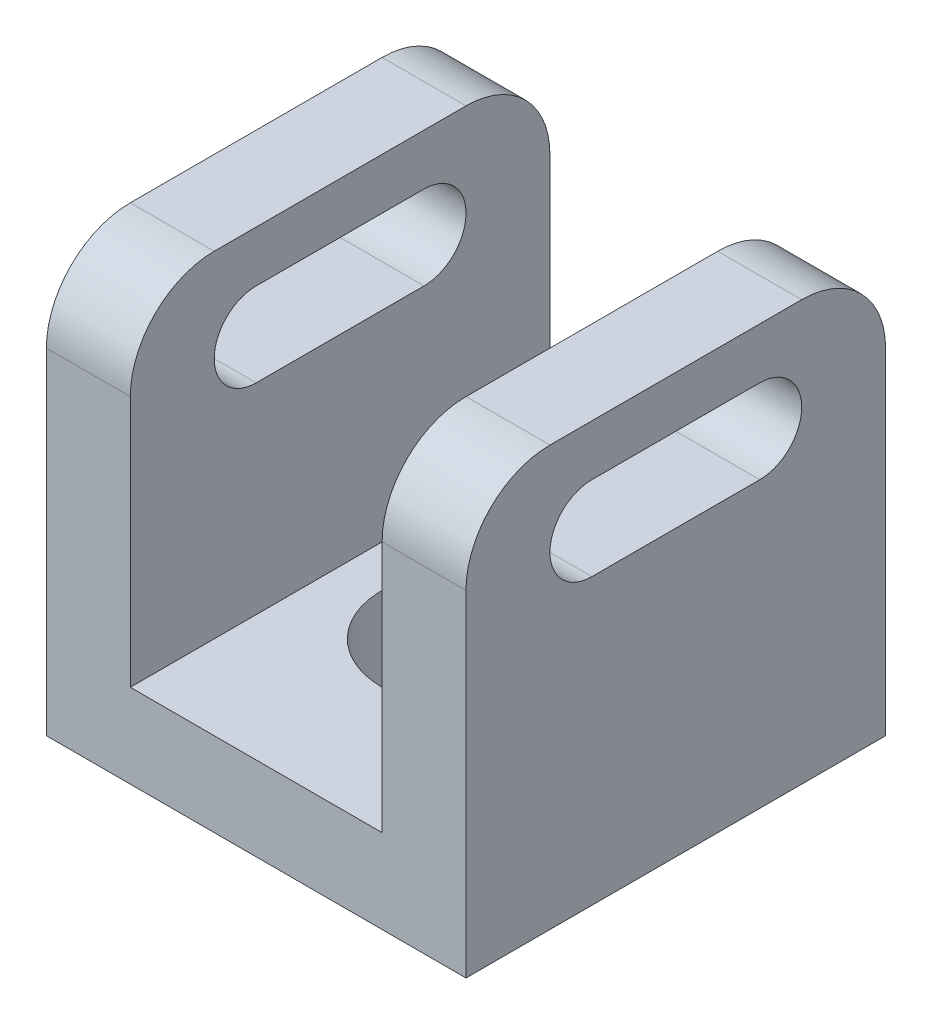
ISO-10303-21;
HEADER;
FILE_DESCRIPTION(('STEP AP214'),'2;1');
FILE_NAME('part.step','',(''),(''),'','','');
FILE_SCHEMA(('AUTOMOTIVE_DESIGN { 1 0 10303 214 1 1 1 1 }'));
ENDSEC;
DATA;
#1=APPLICATION_CONTEXT('core data for automotive mechanical design processes');
#2=APPLICATION_PROTOCOL_DEFINITION('international standard','automotive_design',2000,#1);
#3=PRODUCT_CONTEXT('',#1,'mechanical');
#4=PRODUCT('Part','Part','',(#3));
#5=PRODUCT_RELATED_PRODUCT_CATEGORY('part','',(#4));
#6=PRODUCT_DEFINITION_FORMATION('','',#4);
#7=PRODUCT_DEFINITION_CONTEXT('part definition',#1,'design');
#8=PRODUCT_DEFINITION('design','',#6,#7);
#9=PRODUCT_DEFINITION_SHAPE('','',#8);
#10=(LENGTH_UNIT() NAMED_UNIT(*) SI_UNIT(.MILLI.,.METRE.));
#11=(NAMED_UNIT(*) PLANE_ANGLE_UNIT() SI_UNIT($,.RADIAN.));
#12=(NAMED_UNIT(*) SI_UNIT($,.STERADIAN.) SOLID_ANGLE_UNIT());
#13=UNCERTAINTY_MEASURE_WITH_UNIT(LENGTH_MEASURE(1.E-05),#10,'distance_accuracy_value','');
#14=(GEOMETRIC_REPRESENTATION_CONTEXT(3) GLOBAL_UNCERTAINTY_ASSIGNED_CONTEXT((#13)) GLOBAL_UNIT_ASSIGNED_CONTEXT((#10,
#11,#12)) REPRESENTATION_CONTEXT('',''));
#15=CARTESIAN_POINT('',(0.,0.,0.));
#16=DIRECTION('',(0.,0.,1.));
#17=DIRECTION('',(1.,0.,0.));
#18=AXIS2_PLACEMENT_3D('',#15,#16,#17);
#19=CARTESIAN_POINT('',(-67.2311658603121,21.7065868263473,50.));
#20=DIRECTION('',(1.,0.,0.));
#21=DIRECTION('',(0.,0.,-1.));
#22=AXIS2_PLACEMENT_3D('',#19,#20,#21);
#23=PLANE('',#22);
#24=DIRECTION('',(0.,0.,1.));
#25=VECTOR('',#24,1.);
#26=CARTESIAN_POINT('',(-67.2311658603122,22.6625655060797,35.));
#27=LINE('',#26,#25);
#28=CARTESIAN_POINT('',(-67.2311658603122,22.6625655060797,15.));
#29=VERTEX_POINT('',#28);
#30=CARTESIAN_POINT('',(-67.2311658603122,22.6625655060797,35.));
#31=VERTEX_POINT('',#30);
#32=EDGE_CURVE('E216',#29,#31,#27,.T.);
#33=ORIENTED_EDGE('',*,*,#32,.T.);
#34=CARTESIAN_POINT('',(-67.2311658603121,17.6625655060797,35.));
#35=DIRECTION('',(1.,0.,0.));
#36=DIRECTION('',(0.,1.,0.));
#37=AXIS2_PLACEMENT_3D('',#34,#35,#36);
#38=CIRCLE('',#37,5.);
#39=CARTESIAN_POINT('',(-67.2311658603121,12.6625655060797,35.));
#40=VERTEX_POINT('',#39);
#41=EDGE_CURVE('E193',#31,#40,#38,.T.);
#42=ORIENTED_EDGE('',*,*,#41,.T.);
#43=DIRECTION('',(0.,0.,-1.));
#44=VECTOR('',#43,1.);
#45=CARTESIAN_POINT('',(-67.2311658603121,12.6625655060797,35.));
#46=LINE('',#45,#44);
#47=CARTESIAN_POINT('',(-67.2311658603121,12.6625655060797,15.));
#48=VERTEX_POINT('',#47);
#49=EDGE_CURVE('E205',#40,#48,#46,.T.);
#50=ORIENTED_EDGE('',*,*,#49,.T.);
#51=CARTESIAN_POINT('',(-67.2311658603121,17.6625655060797,15.));
#52=DIRECTION('',(1.,0.,0.));
#53=DIRECTION('',(0.,1.,0.));
#54=AXIS2_PLACEMENT_3D('',#51,#52,#53);
#55=CIRCLE('',#54,5.);
#56=EDGE_CURVE('E212',#48,#29,#55,.T.);
#57=ORIENTED_EDGE('',*,*,#56,.T.);
#58=EDGE_LOOP('',(#33,#42,#50,#57));
#59=FACE_BOUND('',#58,.T.);
#60=DIRECTION('',(0.,-1.,0.));
#61=VECTOR('',#60,1.);
#62=CARTESIAN_POINT('',(-67.2311658603121,21.7065868263473,50.));
#63=LINE('',#62,#61);
#64=CARTESIAN_POINT('',(-67.2311658603121,18.7425149700599,50.));
#65=VERTEX_POINT('',#64);
#66=CARTESIAN_POINT('',(-67.2311658603121,-21.2574850299401,50.));
#67=VERTEX_POINT('',#66);
#68=EDGE_CURVE('E266',#65,#67,#63,.T.);
#69=ORIENTED_EDGE('',*,*,#68,.F.);
#70=CARTESIAN_POINT('',(-67.2311658603121,18.7425149700599,40.));
#71=DIRECTION('',(1.,0.,0.));
#72=DIRECTION('',(0.,0.,-1.));
#73=AXIS2_PLACEMENT_3D('',#70,#71,#72);
#74=CIRCLE('',#73,10.);
#75=CARTESIAN_POINT('',(-67.2311658603121,28.7425149700599,40.));
#76=VERTEX_POINT('',#75);
#77=EDGE_CURVE('E365',#65,#76,#74,.F.);
#78=ORIENTED_EDGE('',*,*,#77,.T.);
#79=DIRECTION('',(0.,0.,-1.));
#80=VECTOR('',#79,1.);
#81=CARTESIAN_POINT('',(-67.2311658603121,28.7425149700599,50.));
#82=LINE('',#81,#80);
#83=CARTESIAN_POINT('',(-67.2311658603121,28.7425149700599,10.));
#84=VERTEX_POINT('',#83);
#85=EDGE_CURVE('E286',#76,#84,#82,.T.);
#86=ORIENTED_EDGE('',*,*,#85,.T.);
#87=CARTESIAN_POINT('',(-67.2311658603121,18.7425149700599,10.));
#88=DIRECTION('',(1.,0.,0.));
#89=DIRECTION('',(0.,0.,-1.));
#90=AXIS2_PLACEMENT_3D('',#87,#88,#89);
#91=CIRCLE('',#90,10.);
#92=CARTESIAN_POINT('',(-67.2311658603121,18.7425149700599,0.));
#93=VERTEX_POINT('',#92);
#94=EDGE_CURVE('E362',#84,#93,#91,.F.);
#95=ORIENTED_EDGE('',*,*,#94,.T.);
#96=DIRECTION('',(0.,-1.,0.));
#97=VECTOR('',#96,1.);
#98=CARTESIAN_POINT('',(-67.2311658603121,21.7065868263473,0.));
#99=LINE('',#98,#97);
#100=CARTESIAN_POINT('',(-67.2311658603121,-21.2574850299401,0.));
#101=VERTEX_POINT('',#100);
#102=EDGE_CURVE('E265',#93,#101,#99,.T.);
#103=ORIENTED_EDGE('',*,*,#102,.T.);
#104=DIRECTION('',(0.,0.,-1.));
#105=VECTOR('',#104,1.);
#106=CARTESIAN_POINT('',(-67.2311658603121,-21.2574850299401,50.));
#107=LINE('',#106,#105);
#108=EDGE_CURVE('E332',#67,#101,#107,.T.);
#109=ORIENTED_EDGE('',*,*,#108,.F.);
#110=EDGE_LOOP('',(#69,#78,#86,#95,#103,#109));
#111=FACE_BOUND('',#110,.T.);
#112=ADVANCED_FACE('F47',(#59,#111),#23,.F.);
#113=CARTESIAN_POINT('',(-67.2311658603121,-21.2574850299401,50.));
#114=DIRECTION('',(0.,1.,0.));
#115=DIRECTION('',(0.,0.,1.));
#116=AXIS2_PLACEMENT_3D('',#113,#114,#115);
#117=PLANE('',#116);
#118=CARTESIAN_POINT('',(-42.2311658603121,-21.2574850299401,25.));
#119=DIRECTION('',(0.,1.,0.));
#120=DIRECTION('',(0.,0.,1.));
#121=AXIS2_PLACEMENT_3D('',#118,#119,#120);
#122=CIRCLE('',#121,10.);
#123=CARTESIAN_POINT('',(-42.2311658603121,-21.2574850299401,35.));
#124=VERTEX_POINT('',#123);
#125=EDGE_CURVE('E261',#124,#124,#122,.F.);
#126=ORIENTED_EDGE('',*,*,#125,.F.);
#127=EDGE_LOOP('',(#126));
#128=FACE_BOUND('',#127,.T.);
#129=DIRECTION('',(1.,0.,0.));
#130=VECTOR('',#129,1.);
#131=CARTESIAN_POINT('',(-67.2311658603121,-21.2574850299401,0.));
#132=LINE('',#131,#130);
#133=CARTESIAN_POINT('',(-17.2311658603121,-21.2574850299401,0.));
#134=VERTEX_POINT('',#133);
#135=EDGE_CURVE('E289',#101,#134,#132,.T.);
#136=ORIENTED_EDGE('',*,*,#135,.T.);
#137=DIRECTION('',(0.,0.,-1.));
#138=VECTOR('',#137,1.);
#139=CARTESIAN_POINT('',(-17.2311658603121,-21.2574850299401,50.));
#140=LINE('',#139,#138);
#141=CARTESIAN_POINT('',(-17.2311658603121,-21.2574850299401,50.));
#142=VERTEX_POINT('',#141);
#143=EDGE_CURVE('E328',#142,#134,#140,.T.);
#144=ORIENTED_EDGE('',*,*,#143,.F.);
#145=DIRECTION('',(1.,0.,0.));
#146=VECTOR('',#145,1.);
#147=CARTESIAN_POINT('',(-67.2311658603121,-21.2574850299401,50.));
#148=LINE('',#147,#146);
#149=EDGE_CURVE('E269',#67,#142,#148,.T.);
#150=ORIENTED_EDGE('',*,*,#149,.F.);
#151=ORIENTED_EDGE('',*,*,#108,.T.);
#152=EDGE_LOOP('',(#136,#144,#150,#151));
#153=FACE_BOUND('',#152,.T.);
#154=ADVANCED_FACE('F447',(#128,#153),#117,.F.);
#155=CARTESIAN_POINT('',(-17.2311658603121,21.7065868263473,50.));
#156=DIRECTION('',(-1.,0.,0.));
#157=DIRECTION('',(0.,-1.,0.));
#158=AXIS2_PLACEMENT_3D('',#155,#156,#157);
#159=PLANE('',#158);
#160=DIRECTION('',(0.,0.,1.));
#161=VECTOR('',#160,1.);
#162=CARTESIAN_POINT('',(-17.2311658603121,12.6625655060798,35.));
#163=LINE('',#162,#161);
#164=CARTESIAN_POINT('',(-17.2311658603121,12.6625655060798,35.));
#165=VERTEX_POINT('',#164);
#166=CARTESIAN_POINT('',(-17.2311658603121,12.6625655060798,15.));
#167=VERTEX_POINT('',#166);
#168=EDGE_CURVE('E241',#165,#167,#163,.F.);
#169=ORIENTED_EDGE('',*,*,#168,.F.);
#170=CARTESIAN_POINT('',(-17.2311658603121,17.6625655060798,35.));
#171=DIRECTION('',(1.,0.,0.));
#172=DIRECTION('',(0.,1.,0.));
#173=AXIS2_PLACEMENT_3D('',#170,#171,#172);
#174=CIRCLE('',#173,5.);
#175=CARTESIAN_POINT('',(-17.2311658603121,22.6625655060798,35.));
#176=VERTEX_POINT('',#175);
#177=EDGE_CURVE('E256',#176,#165,#174,.T.);
#178=ORIENTED_EDGE('',*,*,#177,.F.);
#179=DIRECTION('',(0.,0.,1.));
#180=VECTOR('',#179,1.);
#181=CARTESIAN_POINT('',(-17.2311658603121,22.6625655060798,35.));
#182=LINE('',#181,#180);
#183=CARTESIAN_POINT('',(-17.2311658603121,22.6625655060798,15.));
#184=VERTEX_POINT('',#183);
#185=EDGE_CURVE('E251',#184,#176,#182,.T.);
#186=ORIENTED_EDGE('',*,*,#185,.F.);
#187=CARTESIAN_POINT('',(-17.2311658603121,17.6625655060798,15.));
#188=DIRECTION('',(1.,0.,0.));
#189=DIRECTION('',(0.,1.,0.));
#190=AXIS2_PLACEMENT_3D('',#187,#188,#189);
#191=CIRCLE('',#190,5.);
#192=EDGE_CURVE('E246',#167,#184,#191,.T.);
#193=ORIENTED_EDGE('',*,*,#192,.F.);
#194=EDGE_LOOP('',(#169,#178,#186,#193));
#195=FACE_BOUND('',#194,.T.);
#196=DIRECTION('',(0.,1.,0.));
#197=VECTOR('',#196,1.);
#198=CARTESIAN_POINT('',(-17.2311658603121,21.7065868263473,0.));
#199=LINE('',#198,#197);
#200=CARTESIAN_POINT('',(-17.2311658603121,18.7425149700599,0.));
#201=VERTEX_POINT('',#200);
#202=EDGE_CURVE('E293',#134,#201,#199,.T.);
#203=ORIENTED_EDGE('',*,*,#202,.T.);
#204=CARTESIAN_POINT('',(-17.2311658603121,18.7425149700599,10.));
#205=DIRECTION('',(-1.,0.,0.));
#206=DIRECTION('',(0.,-1.,0.));
#207=AXIS2_PLACEMENT_3D('',#204,#205,#206);
#208=CIRCLE('',#207,10.);
#209=CARTESIAN_POINT('',(-17.2311658603121,28.7425149700599,10.));
#210=VERTEX_POINT('',#209);
#211=EDGE_CURVE('E56',#201,#210,#208,.F.);
#212=ORIENTED_EDGE('',*,*,#211,.T.);
#213=DIRECTION('',(0.,0.,-1.));
#214=VECTOR('',#213,1.);
#215=CARTESIAN_POINT('',(-17.2311658603121,28.7425149700599,50.));
#216=LINE('',#215,#214);
#217=CARTESIAN_POINT('',(-17.2311658603121,28.7425149700599,40.));
#218=VERTEX_POINT('',#217);
#219=EDGE_CURVE('E324',#218,#210,#216,.T.);
#220=ORIENTED_EDGE('',*,*,#219,.F.);
#221=CARTESIAN_POINT('',(-17.2311658603121,18.7425149700599,40.));
#222=DIRECTION('',(-1.,0.,0.));
#223=DIRECTION('',(0.,-1.,0.));
#224=AXIS2_PLACEMENT_3D('',#221,#222,#223);
#225=CIRCLE('',#224,10.);
#226=CARTESIAN_POINT('',(-17.2311658603121,18.7425149700599,50.));
#227=VERTEX_POINT('',#226);
#228=EDGE_CURVE('E63',#218,#227,#225,.F.);
#229=ORIENTED_EDGE('',*,*,#228,.T.);
#230=DIRECTION('',(0.,1.,0.));
#231=VECTOR('',#230,1.);
#232=CARTESIAN_POINT('',(-17.2311658603121,21.7065868263473,50.));
#233=LINE('',#232,#231);
#234=EDGE_CURVE('E273',#142,#227,#233,.T.);
#235=ORIENTED_EDGE('',*,*,#234,.F.);
#236=ORIENTED_EDGE('',*,*,#143,.T.);
#237=EDGE_LOOP('',(#203,#212,#220,#229,#235,#236));
#238=FACE_BOUND('',#237,.T.);
#239=ADVANCED_FACE('F404',(#195,#238),#159,.F.);
#240=CARTESIAN_POINT('',(-17.2311658603121,28.7425149700599,50.));
#241=DIRECTION('',(0.,-1.,0.));
#242=DIRECTION('',(1.,0.,0.));
#243=AXIS2_PLACEMENT_3D('',#240,#241,#242);
#244=PLANE('',#243);
#245=ORIENTED_EDGE('',*,*,#219,.T.);
#246=DIRECTION('',(-1.,0.,0.));
#247=VECTOR('',#246,1.);
#248=CARTESIAN_POINT('',(-27.2311658603121,28.7425149700599,10.));
#249=LINE('',#248,#247);
#250=CARTESIAN_POINT('',(-27.2311658603121,28.7425149700599,10.));
#251=VERTEX_POINT('',#250);
#252=EDGE_CURVE('E387',#210,#251,#249,.T.);
#253=ORIENTED_EDGE('',*,*,#252,.T.);
#254=DIRECTION('',(0.,0.,-1.));
#255=VECTOR('',#254,1.);
#256=CARTESIAN_POINT('',(-27.2311658603121,28.7425149700599,50.));
#257=LINE('',#256,#255);
#258=CARTESIAN_POINT('',(-27.2311658603121,28.7425149700599,40.));
#259=VERTEX_POINT('',#258);
#260=EDGE_CURVE('E320',#259,#251,#257,.T.);
#261=ORIENTED_EDGE('',*,*,#260,.F.);
#262=DIRECTION('',(-1.,0.,0.));
#263=VECTOR('',#262,1.);
#264=CARTESIAN_POINT('',(-17.2311658603121,28.7425149700599,40.));
#265=LINE('',#264,#263);
#266=EDGE_CURVE('E384',#259,#218,#265,.F.);
#267=ORIENTED_EDGE('',*,*,#266,.T.);
#268=EDGE_LOOP('',(#245,#253,#261,#267));
#269=FACE_BOUND('',#268,.T.);
#270=ADVANCED_FACE('F408',(#269),#244,.F.);
#271=CARTESIAN_POINT('',(-27.2311658603121,-11.2574850299401,50.));
#272=DIRECTION('',(1.,0.,0.));
#273=DIRECTION('',(0.,0.,-1.));
#274=AXIS2_PLACEMENT_3D('',#271,#272,#273);
#275=PLANE('',#274);
#276=DIRECTION('',(0.,0.,1.));
#277=VECTOR('',#276,1.);
#278=CARTESIAN_POINT('',(-27.2311658603121,22.6625655060798,50.));
#279=LINE('',#278,#277);
#280=CARTESIAN_POINT('',(-27.2311658603121,22.6625655060798,15.));
#281=VERTEX_POINT('',#280);
#282=CARTESIAN_POINT('',(-27.2311658603121,22.6625655060798,35.));
#283=VERTEX_POINT('',#282);
#284=EDGE_CURVE('E247',#281,#283,#279,.T.);
#285=ORIENTED_EDGE('',*,*,#284,.T.);
#286=CARTESIAN_POINT('',(-27.2311658603121,17.6625655060798,35.));
#287=DIRECTION('',(1.,0.,0.));
#288=DIRECTION('',(0.,0.,-1.));
#289=AXIS2_PLACEMENT_3D('',#286,#287,#288);
#290=CIRCLE('',#289,5.);
#291=CARTESIAN_POINT('',(-27.2311658603121,12.6625655060798,35.));
#292=VERTEX_POINT('',#291);
#293=EDGE_CURVE('E252',#283,#292,#290,.T.);
#294=ORIENTED_EDGE('',*,*,#293,.T.);
#295=DIRECTION('',(0.,0.,-1.));
#296=VECTOR('',#295,1.);
#297=CARTESIAN_POINT('',(-27.2311658603121,12.6625655060798,50.));
#298=LINE('',#297,#296);
#299=CARTESIAN_POINT('',(-27.2311658603121,12.6625655060798,15.));
#300=VERTEX_POINT('',#299);
#301=EDGE_CURVE('E234',#292,#300,#298,.T.);
#302=ORIENTED_EDGE('',*,*,#301,.T.);
#303=CARTESIAN_POINT('',(-27.2311658603121,17.6625655060798,15.));
#304=DIRECTION('',(1.,0.,0.));
#305=DIRECTION('',(0.,0.,-1.));
#306=AXIS2_PLACEMENT_3D('',#303,#304,#305);
#307=CIRCLE('',#306,5.);
#308=EDGE_CURVE('E242',#300,#281,#307,.T.);
#309=ORIENTED_EDGE('',*,*,#308,.T.);
#310=EDGE_LOOP('',(#285,#294,#302,#309));
#311=FACE_BOUND('',#310,.T.);
#312=ORIENTED_EDGE('',*,*,#260,.T.);
#313=CARTESIAN_POINT('',(-27.2311658603121,18.7425149700599,10.));
#314=DIRECTION('',(1.,0.,0.));
#315=DIRECTION('',(0.,0.,-1.));
#316=AXIS2_PLACEMENT_3D('',#313,#314,#315);
#317=CIRCLE('',#316,10.);
#318=CARTESIAN_POINT('',(-27.2311658603121,18.7425149700599,0.));
#319=VERTEX_POINT('',#318);
#320=EDGE_CURVE('E394',#251,#319,#317,.F.);
#321=ORIENTED_EDGE('',*,*,#320,.T.);
#322=DIRECTION('',(0.,-1.,0.));
#323=VECTOR('',#322,1.);
#324=CARTESIAN_POINT('',(-27.2311658603121,-11.2574850299401,0.));
#325=LINE('',#324,#323);
#326=CARTESIAN_POINT('',(-27.2311658603121,-11.2574850299401,0.));
#327=VERTEX_POINT('',#326);
#328=EDGE_CURVE('E296',#319,#327,#325,.T.);
#329=ORIENTED_EDGE('',*,*,#328,.T.);
#330=DIRECTION('',(0.,0.,-1.));
#331=VECTOR('',#330,1.);
#332=CARTESIAN_POINT('',(-27.2311658603121,-11.2574850299401,50.));
#333=LINE('',#332,#331);
#334=CARTESIAN_POINT('',(-27.2311658603121,-11.2574850299401,50.));
#335=VERTEX_POINT('',#334);
#336=EDGE_CURVE('E316',#335,#327,#333,.T.);
#337=ORIENTED_EDGE('',*,*,#336,.F.);
#338=DIRECTION('',(0.,-1.,0.));
#339=VECTOR('',#338,1.);
#340=CARTESIAN_POINT('',(-27.2311658603121,-11.2574850299401,50.));
#341=LINE('',#340,#339);
#342=CARTESIAN_POINT('',(-27.2311658603121,18.7425149700599,50.));
#343=VERTEX_POINT('',#342);
#344=EDGE_CURVE('E276',#343,#335,#341,.T.);
#345=ORIENTED_EDGE('',*,*,#344,.F.);
#346=CARTESIAN_POINT('',(-27.2311658603121,18.7425149700599,40.));
#347=DIRECTION('',(1.,0.,0.));
#348=DIRECTION('',(0.,0.,-1.));
#349=AXIS2_PLACEMENT_3D('',#346,#347,#348);
#350=CIRCLE('',#349,10.);
#351=EDGE_CURVE('E391',#343,#259,#350,.F.);
#352=ORIENTED_EDGE('',*,*,#351,.T.);
#353=EDGE_LOOP('',(#312,#321,#329,#337,#345,#352));
#354=FACE_BOUND('',#353,.T.);
#355=ADVANCED_FACE('F413',(#311,#354),#275,.F.);
#356=CARTESIAN_POINT('',(-57.2311658603121,-11.2574850299401,50.));
#357=DIRECTION('',(0.,-1.,0.));
#358=DIRECTION('',(0.,0.,-1.));
#359=AXIS2_PLACEMENT_3D('',#356,#357,#358);
#360=PLANE('',#359);
#361=CARTESIAN_POINT('',(-42.2311658603121,-11.2574850299401,25.));
#362=DIRECTION('',(0.,1.,0.));
#363=DIRECTION('',(0.,0.,1.));
#364=AXIS2_PLACEMENT_3D('',#361,#362,#363);
#365=CIRCLE('',#364,10.);
#366=CARTESIAN_POINT('',(-42.2311658603121,-11.2574850299401,35.));
#367=VERTEX_POINT('',#366);
#368=EDGE_CURVE('E257',#367,#367,#365,.T.);
#369=ORIENTED_EDGE('',*,*,#368,.F.);
#370=EDGE_LOOP('',(#369));
#371=FACE_BOUND('',#370,.T.);
#372=DIRECTION('',(-1.,0.,0.));
#373=VECTOR('',#372,1.);
#374=CARTESIAN_POINT('',(-57.2311658603121,-11.2574850299401,0.));
#375=LINE('',#374,#373);
#376=CARTESIAN_POINT('',(-57.2311658603121,-11.2574850299401,0.));
#377=VERTEX_POINT('',#376);
#378=EDGE_CURVE('E299',#327,#377,#375,.T.);
#379=ORIENTED_EDGE('',*,*,#378,.T.);
#380=DIRECTION('',(0.,0.,-1.));
#381=VECTOR('',#380,1.);
#382=CARTESIAN_POINT('',(-57.2311658603121,-11.2574850299401,50.));
#383=LINE('',#382,#381);
#384=CARTESIAN_POINT('',(-57.2311658603121,-11.2574850299401,50.));
#385=VERTEX_POINT('',#384);
#386=EDGE_CURVE('E312',#385,#377,#383,.T.);
#387=ORIENTED_EDGE('',*,*,#386,.F.);
#388=DIRECTION('',(-1.,0.,0.));
#389=VECTOR('',#388,1.);
#390=CARTESIAN_POINT('',(-57.2311658603121,-11.2574850299401,50.));
#391=LINE('',#390,#389);
#392=EDGE_CURVE('E279',#335,#385,#391,.T.);
#393=ORIENTED_EDGE('',*,*,#392,.F.);
#394=ORIENTED_EDGE('',*,*,#336,.T.);
#395=EDGE_LOOP('',(#379,#387,#393,#394));
#396=FACE_BOUND('',#395,.T.);
#397=ADVANCED_FACE('F420',(#371,#396),#360,.F.);
#398=CARTESIAN_POINT('',(-57.2311658603121,-11.2574850299401,50.));
#399=DIRECTION('',(-1.,0.,0.));
#400=DIRECTION('',(0.,0.,1.));
#401=AXIS2_PLACEMENT_3D('',#398,#399,#400);
#402=PLANE('',#401);
#403=DIRECTION('',(0.,0.,1.));
#404=VECTOR('',#403,1.);
#405=CARTESIAN_POINT('',(-57.2311658603121,12.6625655060797,50.));
#406=LINE('',#405,#404);
#407=CARTESIAN_POINT('',(-57.2311658603121,12.6625655060798,15.));
#408=VERTEX_POINT('',#407);
#409=CARTESIAN_POINT('',(-57.2311658603121,12.6625655060798,35.));
#410=VERTEX_POINT('',#409);
#411=EDGE_CURVE('E336',#408,#410,#406,.T.);
#412=ORIENTED_EDGE('',*,*,#411,.T.);
#413=CARTESIAN_POINT('',(-57.2311658603121,17.6625655060798,35.));
#414=DIRECTION('',(-1.,0.,0.));
#415=DIRECTION('',(0.,0.,1.));
#416=AXIS2_PLACEMENT_3D('',#413,#414,#415);
#417=CIRCLE('',#416,5.);
#418=CARTESIAN_POINT('',(-57.2311658603121,22.6625655060798,35.));
#419=VERTEX_POINT('',#418);
#420=EDGE_CURVE('E196',#410,#419,#417,.T.);
#421=ORIENTED_EDGE('',*,*,#420,.T.);
#422=DIRECTION('',(0.,0.,-1.));
#423=VECTOR('',#422,1.);
#424=CARTESIAN_POINT('',(-57.2311658603121,22.6625655060798,50.));
#425=LINE('',#424,#423);
#426=CARTESIAN_POINT('',(-57.2311658603121,22.6625655060798,15.));
#427=VERTEX_POINT('',#426);
#428=EDGE_CURVE('E343',#419,#427,#425,.T.);
#429=ORIENTED_EDGE('',*,*,#428,.T.);
#430=CARTESIAN_POINT('',(-57.2311658603121,17.6625655060798,15.));
#431=DIRECTION('',(-1.,0.,0.));
#432=DIRECTION('',(0.,0.,1.));
#433=AXIS2_PLACEMENT_3D('',#430,#431,#432);
#434=CIRCLE('',#433,5.);
#435=EDGE_CURVE('E339',#427,#408,#434,.T.);
#436=ORIENTED_EDGE('',*,*,#435,.T.);
#437=EDGE_LOOP('',(#412,#421,#429,#436));
#438=FACE_BOUND('',#437,.T.);
#439=DIRECTION('',(0.,0.,-1.));
#440=VECTOR('',#439,1.);
#441=CARTESIAN_POINT('',(-57.2311658603121,28.7425149700599,50.));
#442=LINE('',#441,#440);
#443=CARTESIAN_POINT('',(-57.2311658603121,28.7425149700599,40.));
#444=VERTEX_POINT('',#443);
#445=CARTESIAN_POINT('',(-57.2311658603121,28.7425149700599,10.));
#446=VERTEX_POINT('',#445);
#447=EDGE_CURVE('E308',#444,#446,#442,.T.);
#448=ORIENTED_EDGE('',*,*,#447,.F.);
#449=CARTESIAN_POINT('',(-57.2311658603121,18.7425149700599,40.));
#450=DIRECTION('',(-1.,0.,0.));
#451=DIRECTION('',(0.,0.,1.));
#452=AXIS2_PLACEMENT_3D('',#449,#450,#451);
#453=CIRCLE('',#452,10.);
#454=CARTESIAN_POINT('',(-57.2311658603121,18.7425149700599,50.));
#455=VERTEX_POINT('',#454);
#456=EDGE_CURVE('E378',#444,#455,#453,.F.);
#457=ORIENTED_EDGE('',*,*,#456,.T.);
#458=DIRECTION('',(0.,1.,0.));
#459=VECTOR('',#458,1.);
#460=CARTESIAN_POINT('',(-57.2311658603121,-11.2574850299401,50.));
#461=LINE('',#460,#459);
#462=EDGE_CURVE('E282',#385,#455,#461,.T.);
#463=ORIENTED_EDGE('',*,*,#462,.F.);
#464=ORIENTED_EDGE('',*,*,#386,.T.);
#465=DIRECTION('',(0.,1.,0.));
#466=VECTOR('',#465,1.);
#467=CARTESIAN_POINT('',(-57.2311658603121,-11.2574850299401,0.));
#468=LINE('',#467,#466);
#469=CARTESIAN_POINT('',(-57.2311658603121,18.7425149700599,0.));
#470=VERTEX_POINT('',#469);
#471=EDGE_CURVE('E270',#377,#470,#468,.T.);
#472=ORIENTED_EDGE('',*,*,#471,.T.);
#473=CARTESIAN_POINT('',(-57.2311658603121,18.7425149700599,10.));
#474=DIRECTION('',(-1.,0.,0.));
#475=DIRECTION('',(0.,0.,1.));
#476=AXIS2_PLACEMENT_3D('',#473,#474,#475);
#477=CIRCLE('',#476,10.);
#478=EDGE_CURVE('E375',#470,#446,#477,.F.);
#479=ORIENTED_EDGE('',*,*,#478,.T.);
#480=EDGE_LOOP('',(#448,#457,#463,#464,#472,#479));
#481=FACE_BOUND('',#480,.T.);
#482=ADVANCED_FACE('F425',(#438,#481),#402,.F.);
#483=CARTESIAN_POINT('',(-67.2311658603121,28.7425149700599,50.));
#484=DIRECTION('',(0.,-1.,0.));
#485=DIRECTION('',(1.,0.,0.));
#486=AXIS2_PLACEMENT_3D('',#483,#484,#485);
#487=PLANE('',#486);
#488=ORIENTED_EDGE('',*,*,#85,.F.);
#489=DIRECTION('',(-1.,0.,0.));
#490=VECTOR('',#489,1.);
#491=CARTESIAN_POINT('',(-67.2311658603121,28.7425149700599,40.));
#492=LINE('',#491,#490);
#493=EDGE_CURVE('E372',#76,#444,#492,.F.);
#494=ORIENTED_EDGE('',*,*,#493,.T.);
#495=ORIENTED_EDGE('',*,*,#447,.T.);
#496=DIRECTION('',(-1.,0.,0.));
#497=VECTOR('',#496,1.);
#498=CARTESIAN_POINT('',(-67.2311658603121,28.7425149700599,10.));
#499=LINE('',#498,#497);
#500=EDGE_CURVE('E368',#446,#84,#499,.T.);
#501=ORIENTED_EDGE('',*,*,#500,.T.);
#502=EDGE_LOOP('',(#488,#494,#495,#501));
#503=FACE_BOUND('',#502,.T.);
#504=ADVANCED_FACE('F438',(#503),#487,.F.);
#505=CARTESIAN_POINT('',(0.,0.,50.));
#506=DIRECTION('',(0.,0.,-1.));
#507=DIRECTION('',(-1.,0.,0.));
#508=AXIS2_PLACEMENT_3D('',#505,#506,#507);
#509=PLANE('',#508);
#510=ORIENTED_EDGE('',*,*,#234,.T.);
#511=DIRECTION('',(-1.,0.,0.));
#512=VECTOR('',#511,1.);
#513=CARTESIAN_POINT('',(0.,18.7425149700599,50.));
#514=LINE('',#513,#512);
#515=EDGE_CURVE('E11',#227,#343,#514,.T.);
#516=ORIENTED_EDGE('',*,*,#515,.T.);
#517=ORIENTED_EDGE('',*,*,#344,.T.);
#518=ORIENTED_EDGE('',*,*,#392,.T.);
#519=ORIENTED_EDGE('',*,*,#462,.T.);
#520=DIRECTION('',(-1.,0.,0.));
#521=VECTOR('',#520,1.);
#522=CARTESIAN_POINT('',(0.,18.7425149700598,50.));
#523=LINE('',#522,#521);
#524=EDGE_CURVE('E349',#455,#65,#523,.T.);
#525=ORIENTED_EDGE('',*,*,#524,.T.);
#526=ORIENTED_EDGE('',*,*,#68,.T.);
#527=ORIENTED_EDGE('',*,*,#149,.T.);
#528=EDGE_LOOP('',(#510,#516,#517,#518,#519,#525,#526,#527));
#529=FACE_BOUND('',#528,.T.);
#530=ADVANCED_FACE('F430',(#529),#509,.F.);
#531=CARTESIAN_POINT('',(0.,0.,0.));
#532=DIRECTION('',(0.,0.,-1.));
#533=DIRECTION('',(-1.,0.,0.));
#534=AXIS2_PLACEMENT_3D('',#531,#532,#533);
#535=PLANE('',#534);
#536=ORIENTED_EDGE('',*,*,#328,.F.);
#537=DIRECTION('',(-1.,0.,0.));
#538=VECTOR('',#537,1.);
#539=CARTESIAN_POINT('',(-17.2311658603121,18.7425149700599,0.));
#540=LINE('',#539,#538);
#541=EDGE_CURVE('E71',#319,#201,#540,.F.);
#542=ORIENTED_EDGE('',*,*,#541,.T.);
#543=ORIENTED_EDGE('',*,*,#202,.F.);
#544=ORIENTED_EDGE('',*,*,#135,.F.);
#545=ORIENTED_EDGE('',*,*,#102,.F.);
#546=DIRECTION('',(-1.,0.,0.));
#547=VECTOR('',#546,1.);
#548=CARTESIAN_POINT('',(-57.2311658603121,18.7425149700599,0.));
#549=LINE('',#548,#547);
#550=EDGE_CURVE('E381',#93,#470,#549,.F.);
#551=ORIENTED_EDGE('',*,*,#550,.T.);
#552=ORIENTED_EDGE('',*,*,#471,.F.);
#553=ORIENTED_EDGE('',*,*,#378,.F.);
#554=EDGE_LOOP('',(#536,#542,#543,#544,#545,#551,#552,#553));
#555=FACE_BOUND('',#554,.T.);
#556=ADVANCED_FACE('F416',(#555),#535,.T.);
#557=CARTESIAN_POINT('',(-42.2311658603121,-21.2584850299401,25.));
#558=DIRECTION('',(0.,1.,0.));
#559=DIRECTION('',(0.,0.,1.));
#560=AXIS2_PLACEMENT_3D('',#557,#558,#559);
#561=CYLINDRICAL_SURFACE('',#560,10.);
#562=ORIENTED_EDGE('',*,*,#368,.T.);
#563=EDGE_LOOP('',(#562));
#564=FACE_BOUND('',#563,.T.);
#565=ORIENTED_EDGE('',*,*,#125,.T.);
#566=EDGE_LOOP('',(#565));
#567=FACE_BOUND('',#566,.T.);
#568=ADVANCED_FACE('F514',(#564,#567),#561,.F.);
#569=CARTESIAN_POINT('',(-67.2311658603121,12.6625655060797,35.));
#570=DIRECTION('',(0.,-1.,0.));
#571=DIRECTION('',(1.,0.,0.));
#572=AXIS2_PLACEMENT_3D('',#569,#570,#571);
#573=PLANE('',#572);
#574=DIRECTION('',(1.,0.,0.));
#575=VECTOR('',#574,1.);
#576=CARTESIAN_POINT('',(-67.2311658603121,12.6625655060797,15.));
#577=LINE('',#576,#575);
#578=EDGE_CURVE('E208',#48,#408,#577,.T.);
#579=ORIENTED_EDGE('',*,*,#578,.F.);
#580=ORIENTED_EDGE('',*,*,#49,.F.);
#581=DIRECTION('',(1.,0.,0.));
#582=VECTOR('',#581,1.);
#583=CARTESIAN_POINT('',(-67.2311658603121,12.6625655060797,35.));
#584=LINE('',#583,#582);
#585=EDGE_CURVE('E188',#40,#410,#584,.T.);
#586=ORIENTED_EDGE('',*,*,#585,.T.);
#587=ORIENTED_EDGE('',*,*,#411,.F.);
#588=EDGE_LOOP('',(#579,#580,#586,#587));
#589=FACE_BOUND('',#588,.T.);
#590=ADVANCED_FACE('F206',(#589),#573,.F.);
#591=CARTESIAN_POINT('',(-67.2311658603121,17.6625655060797,15.));
#592=DIRECTION('',(1.,0.,0.));
#593=DIRECTION('',(0.,1.,0.));
#594=AXIS2_PLACEMENT_3D('',#591,#592,#593);
#595=CYLINDRICAL_SURFACE('',#594,5.);
#596=DIRECTION('',(1.,0.,0.));
#597=VECTOR('',#596,1.);
#598=CARTESIAN_POINT('',(-67.2311658603122,22.6625655060797,15.));
#599=LINE('',#598,#597);
#600=EDGE_CURVE('E226',#29,#427,#599,.T.);
#601=ORIENTED_EDGE('',*,*,#600,.F.);
#602=ORIENTED_EDGE('',*,*,#56,.F.);
#603=ORIENTED_EDGE('',*,*,#578,.T.);
#604=ORIENTED_EDGE('',*,*,#435,.F.);
#605=EDGE_LOOP('',(#601,#602,#603,#604));
#606=FACE_BOUND('',#605,.T.);
#607=ADVANCED_FACE('F550',(#606),#595,.F.);
#608=CARTESIAN_POINT('',(-67.2311658603122,22.6625655060797,35.));
#609=DIRECTION('',(0.,1.,0.));
#610=DIRECTION('',(-1.,0.,0.));
#611=AXIS2_PLACEMENT_3D('',#608,#609,#610);
#612=PLANE('',#611);
#613=DIRECTION('',(1.,0.,0.));
#614=VECTOR('',#613,1.);
#615=CARTESIAN_POINT('',(-67.2311658603122,22.6625655060797,35.));
#616=LINE('',#615,#614);
#617=EDGE_CURVE('E232',#31,#419,#616,.T.);
#618=ORIENTED_EDGE('',*,*,#617,.F.);
#619=ORIENTED_EDGE('',*,*,#32,.F.);
#620=ORIENTED_EDGE('',*,*,#600,.T.);
#621=ORIENTED_EDGE('',*,*,#428,.F.);
#622=EDGE_LOOP('',(#618,#619,#620,#621));
#623=FACE_BOUND('',#622,.T.);
#624=ADVANCED_FACE('F560',(#623),#612,.F.);
#625=CARTESIAN_POINT('',(-67.2311658603121,17.6625655060797,35.));
#626=DIRECTION('',(1.,0.,0.));
#627=DIRECTION('',(0.,1.,0.));
#628=AXIS2_PLACEMENT_3D('',#625,#626,#627);
#629=CYLINDRICAL_SURFACE('',#628,5.);
#630=ORIENTED_EDGE('',*,*,#585,.F.);
#631=ORIENTED_EDGE('',*,*,#41,.F.);
#632=ORIENTED_EDGE('',*,*,#617,.T.);
#633=ORIENTED_EDGE('',*,*,#420,.F.);
#634=EDGE_LOOP('',(#630,#631,#632,#633));
#635=FACE_BOUND('',#634,.T.);
#636=ADVANCED_FACE('F190',(#635),#629,.F.);
#637=EDGE_CURVE('E201',#292,#165,#584,.T.);
#638=ORIENTED_EDGE('',*,*,#637,.F.);
#639=ORIENTED_EDGE('',*,*,#293,.F.);
#640=EDGE_CURVE('E230',#283,#176,#616,.T.);
#641=ORIENTED_EDGE('',*,*,#640,.T.);
#642=ORIENTED_EDGE('',*,*,#177,.T.);
#643=EDGE_LOOP('',(#638,#639,#641,#642));
#644=FACE_BOUND('',#643,.T.);
#645=ADVANCED_FACE('F557',(#644),#629,.F.);
#646=ORIENTED_EDGE('',*,*,#640,.F.);
#647=ORIENTED_EDGE('',*,*,#284,.F.);
#648=EDGE_CURVE('E231',#281,#184,#599,.T.);
#649=ORIENTED_EDGE('',*,*,#648,.T.);
#650=ORIENTED_EDGE('',*,*,#185,.T.);
#651=EDGE_LOOP('',(#646,#647,#649,#650));
#652=FACE_BOUND('',#651,.T.);
#653=ADVANCED_FACE('F547',(#652),#612,.F.);
#654=ORIENTED_EDGE('',*,*,#648,.F.);
#655=ORIENTED_EDGE('',*,*,#308,.F.);
#656=EDGE_CURVE('E200',#300,#167,#577,.T.);
#657=ORIENTED_EDGE('',*,*,#656,.T.);
#658=ORIENTED_EDGE('',*,*,#192,.T.);
#659=EDGE_LOOP('',(#654,#655,#657,#658));
#660=FACE_BOUND('',#659,.T.);
#661=ADVANCED_FACE('F538',(#660),#595,.F.);
#662=ORIENTED_EDGE('',*,*,#656,.F.);
#663=ORIENTED_EDGE('',*,*,#301,.F.);
#664=ORIENTED_EDGE('',*,*,#637,.T.);
#665=ORIENTED_EDGE('',*,*,#168,.T.);
#666=EDGE_LOOP('',(#662,#663,#664,#665));
#667=FACE_BOUND('',#666,.T.);
#668=ADVANCED_FACE('F469',(#667),#573,.F.);
#669=CARTESIAN_POINT('',(0.,18.7425149700598,40.));
#670=DIRECTION('',(-1.,0.,0.));
#671=DIRECTION('',(0.,-1.,0.));
#672=AXIS2_PLACEMENT_3D('',#669,#670,#671);
#673=CYLINDRICAL_SURFACE('',#672,10.);
#674=ORIENTED_EDGE('',*,*,#456,.F.);
#675=ORIENTED_EDGE('',*,*,#493,.F.);
#676=ORIENTED_EDGE('',*,*,#77,.F.);
#677=ORIENTED_EDGE('',*,*,#524,.F.);
#678=EDGE_LOOP('',(#674,#675,#676,#677));
#679=FACE_BOUND('',#678,.T.);
#680=ADVANCED_FACE('F433',(#679),#673,.T.);
#681=CARTESIAN_POINT('',(-67.2311658603121,18.7425149700599,10.));
#682=DIRECTION('',(1.,0.,0.));
#683=DIRECTION('',(0.,1.,0.));
#684=AXIS2_PLACEMENT_3D('',#681,#682,#683);
#685=CYLINDRICAL_SURFACE('',#684,10.);
#686=ORIENTED_EDGE('',*,*,#478,.F.);
#687=ORIENTED_EDGE('',*,*,#550,.F.);
#688=ORIENTED_EDGE('',*,*,#94,.F.);
#689=ORIENTED_EDGE('',*,*,#500,.F.);
#690=EDGE_LOOP('',(#686,#687,#688,#689));
#691=FACE_BOUND('',#690,.T.);
#692=ADVANCED_FACE('F441',(#691),#685,.T.);
#693=CARTESIAN_POINT('',(-17.2311658603121,18.7425149700599,10.));
#694=DIRECTION('',(1.,0.,0.));
#695=DIRECTION('',(0.,1.,0.));
#696=AXIS2_PLACEMENT_3D('',#693,#694,#695);
#697=CYLINDRICAL_SURFACE('',#696,10.);
#698=ORIENTED_EDGE('',*,*,#211,.F.);
#699=ORIENTED_EDGE('',*,*,#541,.F.);
#700=ORIENTED_EDGE('',*,*,#320,.F.);
#701=ORIENTED_EDGE('',*,*,#252,.F.);
#702=EDGE_LOOP('',(#698,#699,#700,#701));
#703=FACE_BOUND('',#702,.T.);
#704=ADVANCED_FACE('F411',(#703),#697,.T.);
#705=CARTESIAN_POINT('',(0.,18.7425149700599,40.));
#706=DIRECTION('',(-1.,0.,0.));
#707=DIRECTION('',(0.,-1.,0.));
#708=AXIS2_PLACEMENT_3D('',#705,#706,#707);
#709=CYLINDRICAL_SURFACE('',#708,10.);
#710=ORIENTED_EDGE('',*,*,#228,.F.);
#711=ORIENTED_EDGE('',*,*,#266,.F.);
#712=ORIENTED_EDGE('',*,*,#351,.F.);
#713=ORIENTED_EDGE('',*,*,#515,.F.);
#714=EDGE_LOOP('',(#710,#711,#712,#713));
#715=FACE_BOUND('',#714,.T.);
#716=ADVANCED_FACE('F49',(#715),#709,.T.);
#717=CLOSED_SHELL('',(#112,#154,#239,#270,#355,#397,#482,#504,#530,#556,#568,#590,#607,#624,
#636,#645,#653,#661,#668,#680,#692,#704,#716));
#718=MANIFOLD_SOLID_BREP('B2',#717);
#719=ADVANCED_BREP_SHAPE_REPRESENTATION('',(#18,#718),#14);
#720=SHAPE_DEFINITION_REPRESENTATION(#9,#719);
ENDSEC;
END-ISO-10303-21;
